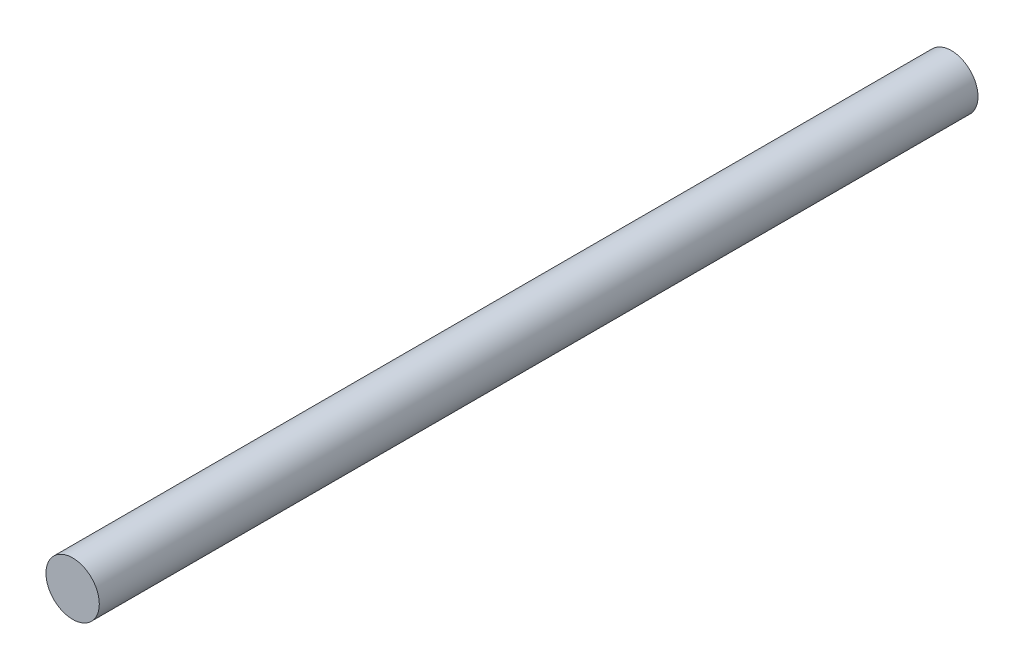
ISO-10303-21;
HEADER;
FILE_DESCRIPTION(('STEP AP214'),'2;1');
FILE_NAME('part.step','',(''),(''),'','','');
FILE_SCHEMA(('AUTOMOTIVE_DESIGN { 1 0 10303 214 1 1 1 1 }'));
ENDSEC;
DATA;
#1=APPLICATION_CONTEXT('core data for automotive mechanical design processes');
#2=APPLICATION_PROTOCOL_DEFINITION('international standard','automotive_design',2000,#1);
#3=PRODUCT_CONTEXT('',#1,'mechanical');
#4=PRODUCT('Part','Part','',(#3));
#5=PRODUCT_RELATED_PRODUCT_CATEGORY('part','',(#4));
#6=PRODUCT_DEFINITION_FORMATION('','',#4);
#7=PRODUCT_DEFINITION_CONTEXT('part definition',#1,'design');
#8=PRODUCT_DEFINITION('design','',#6,#7);
#9=PRODUCT_DEFINITION_SHAPE('','',#8);
#10=(LENGTH_UNIT() NAMED_UNIT(*) SI_UNIT(.MILLI.,.METRE.));
#11=(NAMED_UNIT(*) PLANE_ANGLE_UNIT() SI_UNIT($,.RADIAN.));
#12=(NAMED_UNIT(*) SI_UNIT($,.STERADIAN.) SOLID_ANGLE_UNIT());
#13=UNCERTAINTY_MEASURE_WITH_UNIT(LENGTH_MEASURE(1.E-05),#10,'distance_accuracy_value','');
#14=(GEOMETRIC_REPRESENTATION_CONTEXT(3) GLOBAL_UNCERTAINTY_ASSIGNED_CONTEXT((#13)) GLOBAL_UNIT_ASSIGNED_CONTEXT((#10,
#11,#12)) REPRESENTATION_CONTEXT('',''));
#15=CARTESIAN_POINT('',(0.,0.,0.));
#16=DIRECTION('',(0.,0.,1.));
#17=DIRECTION('',(1.,0.,0.));
#18=AXIS2_PLACEMENT_3D('',#15,#16,#17);
#19=CARTESIAN_POINT('',(0.,0.,280.));
#20=DIRECTION('',(0.,0.,-1.));
#21=DIRECTION('',(-1.,0.,0.));
#22=AXIS2_PLACEMENT_3D('',#19,#20,#21);
#23=CYLINDRICAL_SURFACE('',#22,8.5);
#24=CARTESIAN_POINT('',(0.,0.,280.));
#25=DIRECTION('',(0.,0.,1.));
#26=DIRECTION('',(1.,0.,0.));
#27=AXIS2_PLACEMENT_3D('',#24,#25,#26);
#28=CIRCLE('',#27,8.5);
#29=CARTESIAN_POINT('',(8.5,0.,280.));
#30=VERTEX_POINT('',#29);
#31=EDGE_CURVE('E10',#30,#30,#28,.T.);
#32=ORIENTED_EDGE('',*,*,#31,.F.);
#33=EDGE_LOOP('',(#32));
#34=FACE_BOUND('',#33,.T.);
#35=CARTESIAN_POINT('',(0.,0.,0.));
#36=DIRECTION('',(0.,0.,1.));
#37=DIRECTION('',(1.,0.,0.));
#38=AXIS2_PLACEMENT_3D('',#35,#36,#37);
#39=CIRCLE('',#38,8.5);
#40=CARTESIAN_POINT('',(8.5,0.,0.));
#41=VERTEX_POINT('',#40);
#42=EDGE_CURVE('E34',#41,#41,#39,.T.);
#43=ORIENTED_EDGE('',*,*,#42,.T.);
#44=EDGE_LOOP('',(#43));
#45=FACE_BOUND('',#44,.T.);
#46=ADVANCED_FACE('F31',(#34,#45),#23,.T.);
#47=CARTESIAN_POINT('',(0.,0.,280.));
#48=DIRECTION('',(0.,0.,1.));
#49=DIRECTION('',(1.,0.,0.));
#50=AXIS2_PLACEMENT_3D('',#47,#48,#49);
#51=PLANE('',#50);
#52=ORIENTED_EDGE('',*,*,#31,.T.);
#53=EDGE_LOOP('',(#52));
#54=FACE_BOUND('',#53,.T.);
#55=ADVANCED_FACE('F46',(#54),#51,.T.);
#56=CARTESIAN_POINT('',(0.,0.,0.));
#57=DIRECTION('',(0.,0.,1.));
#58=DIRECTION('',(1.,0.,0.));
#59=AXIS2_PLACEMENT_3D('',#56,#57,#58);
#60=PLANE('',#59);
#61=ORIENTED_EDGE('',*,*,#42,.F.);
#62=EDGE_LOOP('',(#61));
#63=FACE_BOUND('',#62,.T.);
#64=ADVANCED_FACE('F44',(#63),#60,.F.);
#65=CLOSED_SHELL('',(#46,#55,#64));
#66=MANIFOLD_SOLID_BREP('B2',#65);
#67=ADVANCED_BREP_SHAPE_REPRESENTATION('',(#18,#66),#14);
#68=SHAPE_DEFINITION_REPRESENTATION(#9,#67);
ENDSEC;
END-ISO-10303-21;
